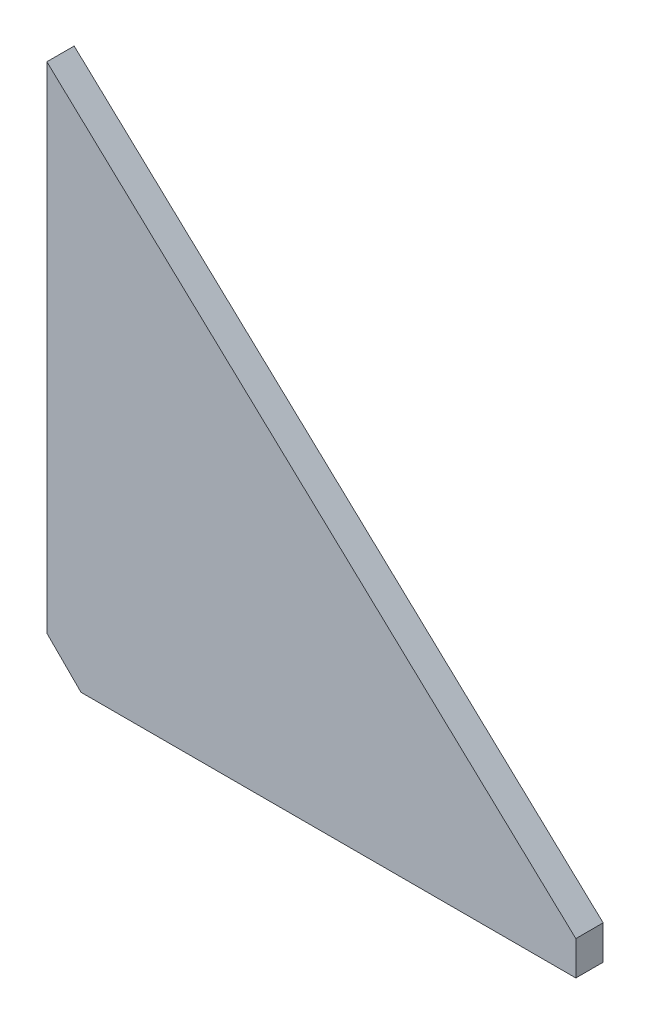
ISO-10303-21;
HEADER;
FILE_DESCRIPTION(('STEP AP214'),'2;1');
FILE_NAME('part.step','',(''),(''),'','','');
FILE_SCHEMA(('AUTOMOTIVE_DESIGN { 1 0 10303 214 1 1 1 1 }'));
ENDSEC;
DATA;
#1=APPLICATION_CONTEXT('core data for automotive mechanical design processes');
#2=APPLICATION_PROTOCOL_DEFINITION('international standard','automotive_design',2000,#1);
#3=PRODUCT_CONTEXT('',#1,'mechanical');
#4=PRODUCT('Part','Part','',(#3));
#5=PRODUCT_RELATED_PRODUCT_CATEGORY('part','',(#4));
#6=PRODUCT_DEFINITION_FORMATION('','',#4);
#7=PRODUCT_DEFINITION_CONTEXT('part definition',#1,'design');
#8=PRODUCT_DEFINITION('design','',#6,#7);
#9=PRODUCT_DEFINITION_SHAPE('','',#8);
#10=(LENGTH_UNIT() NAMED_UNIT(*) SI_UNIT(.MILLI.,.METRE.));
#11=(NAMED_UNIT(*) PLANE_ANGLE_UNIT() SI_UNIT($,.RADIAN.));
#12=(NAMED_UNIT(*) SI_UNIT($,.STERADIAN.) SOLID_ANGLE_UNIT());
#13=UNCERTAINTY_MEASURE_WITH_UNIT(LENGTH_MEASURE(1.E-05),#10,'distance_accuracy_value','');
#14=(GEOMETRIC_REPRESENTATION_CONTEXT(3) GLOBAL_UNCERTAINTY_ASSIGNED_CONTEXT((#13)) GLOBAL_UNIT_ASSIGNED_CONTEXT((#10,
#11,#12)) REPRESENTATION_CONTEXT('',''));
#15=CARTESIAN_POINT('',(0.,0.,0.));
#16=DIRECTION('',(0.,0.,1.));
#17=DIRECTION('',(1.,0.,0.));
#18=AXIS2_PLACEMENT_3D('',#15,#16,#17);
#19=CARTESIAN_POINT('',(66.9213649851632,-2.98961424332345,8.));
#20=DIRECTION('',(-1.,0.,0.));
#21=DIRECTION('',(0.,0.,1.));
#22=AXIS2_PLACEMENT_3D('',#19,#20,#21);
#23=PLANE('',#22);
#24=DIRECTION('',(0.,1.,0.));
#25=VECTOR('',#24,1.);
#26=CARTESIAN_POINT('',(66.9213649851632,-2.98961424332345,0.));
#27=LINE('',#26,#25);
#28=CARTESIAN_POINT('',(66.9213649851632,-2.98961424332345,0.));
#29=VERTEX_POINT('',#28);
#30=CARTESIAN_POINT('',(66.9213649851632,7.01038575667657,0.));
#31=VERTEX_POINT('',#30);
#32=EDGE_CURVE('E110',#29,#31,#27,.T.);
#33=ORIENTED_EDGE('',*,*,#32,.T.);
#34=DIRECTION('',(0.,0.,-1.));
#35=VECTOR('',#34,1.);
#36=CARTESIAN_POINT('',(66.9213649851632,7.01038575667657,8.));
#37=LINE('',#36,#35);
#38=CARTESIAN_POINT('',(66.9213649851632,7.01038575667657,8.));
#39=VERTEX_POINT('',#38);
#40=EDGE_CURVE('E11',#39,#31,#37,.T.);
#41=ORIENTED_EDGE('',*,*,#40,.F.);
#42=DIRECTION('',(0.,1.,0.));
#43=VECTOR('',#42,1.);
#44=CARTESIAN_POINT('',(66.9213649851632,-2.98961424332345,8.));
#45=LINE('',#44,#43);
#46=CARTESIAN_POINT('',(66.9213649851632,-2.98961424332345,8.));
#47=VERTEX_POINT('',#46);
#48=EDGE_CURVE('E118',#47,#39,#45,.T.);
#49=ORIENTED_EDGE('',*,*,#48,.F.);
#50=DIRECTION('',(0.,0.,-1.));
#51=VECTOR('',#50,1.);
#52=CARTESIAN_POINT('',(66.9213649851632,-2.98961424332345,8.));
#53=LINE('',#52,#51);
#54=EDGE_CURVE('E106',#47,#29,#53,.T.);
#55=ORIENTED_EDGE('',*,*,#54,.T.);
#56=EDGE_LOOP('',(#33,#41,#49,#55));
#57=FACE_BOUND('',#56,.T.);
#58=ADVANCED_FACE('F36',(#57),#23,.F.);
#59=CARTESIAN_POINT('',(66.9213649851632,7.01038575667657,8.));
#60=DIRECTION('',(-0.683157128775741,-0.730271413518896,0.));
#61=DIRECTION('',(0.730271413518896,-0.683157128775741,0.));
#62=AXIS2_PLACEMENT_3D('',#59,#60,#61);
#63=PLANE('',#62);
#64=DIRECTION('',(-0.730271413518896,0.683157128775741,0.));
#65=VECTOR('',#64,1.);
#66=CARTESIAN_POINT('',(66.9213649851632,7.01038575667657,0.));
#67=LINE('',#66,#65);
#68=CARTESIAN_POINT('',(-88.0786350148368,152.010385756677,0.));
#69=VERTEX_POINT('',#68);
#70=EDGE_CURVE('E113',#31,#69,#67,.T.);
#71=ORIENTED_EDGE('',*,*,#70,.T.);
#72=DIRECTION('',(0.,0.,-1.));
#73=VECTOR('',#72,1.);
#74=CARTESIAN_POINT('',(-88.0786350148368,152.010385756677,8.));
#75=LINE('',#74,#73);
#76=CARTESIAN_POINT('',(-88.0786350148368,152.010385756677,8.));
#77=VERTEX_POINT('',#76);
#78=EDGE_CURVE('E44',#77,#69,#75,.T.);
#79=ORIENTED_EDGE('',*,*,#78,.F.);
#80=DIRECTION('',(-0.730271413518896,0.683157128775741,0.));
#81=VECTOR('',#80,1.);
#82=CARTESIAN_POINT('',(66.9213649851632,7.01038575667657,8.));
#83=LINE('',#82,#81);
#84=EDGE_CURVE('E86',#39,#77,#83,.T.);
#85=ORIENTED_EDGE('',*,*,#84,.F.);
#86=ORIENTED_EDGE('',*,*,#40,.T.);
#87=EDGE_LOOP('',(#71,#79,#85,#86));
#88=FACE_BOUND('',#87,.T.);
#89=ADVANCED_FACE('F137',(#88),#63,.F.);
#90=CARTESIAN_POINT('',(-88.0786350148368,7.01038575667655,8.));
#91=DIRECTION('',(1.,0.,0.));
#92=DIRECTION('',(0.,0.,-1.));
#93=AXIS2_PLACEMENT_3D('',#90,#91,#92);
#94=PLANE('',#93);
#95=DIRECTION('',(0.,-1.,0.));
#96=VECTOR('',#95,1.);
#97=CARTESIAN_POINT('',(-88.0786350148368,7.01038575667655,0.));
#98=LINE('',#97,#96);
#99=CARTESIAN_POINT('',(-88.0786350148368,7.01038575667655,0.));
#100=VERTEX_POINT('',#99);
#101=EDGE_CURVE('E101',#69,#100,#98,.T.);
#102=ORIENTED_EDGE('',*,*,#101,.T.);
#103=DIRECTION('',(0.,0.,-1.));
#104=VECTOR('',#103,1.);
#105=CARTESIAN_POINT('',(-88.0786350148368,7.01038575667655,8.));
#106=LINE('',#105,#104);
#107=CARTESIAN_POINT('',(-88.0786350148368,7.01038575667655,8.));
#108=VERTEX_POINT('',#107);
#109=EDGE_CURVE('E98',#108,#100,#106,.T.);
#110=ORIENTED_EDGE('',*,*,#109,.F.);
#111=DIRECTION('',(0.,-1.,0.));
#112=VECTOR('',#111,1.);
#113=CARTESIAN_POINT('',(-88.0786350148368,7.01038575667655,8.));
#114=LINE('',#113,#112);
#115=EDGE_CURVE('E90',#77,#108,#114,.T.);
#116=ORIENTED_EDGE('',*,*,#115,.F.);
#117=ORIENTED_EDGE('',*,*,#78,.T.);
#118=EDGE_LOOP('',(#102,#110,#116,#117));
#119=FACE_BOUND('',#118,.T.);
#120=ADVANCED_FACE('F99',(#119),#94,.F.);
#121=CARTESIAN_POINT('',(-88.0786350148368,7.01038575667655,8.));
#122=DIRECTION('',(0.707106781186548,0.707106781186547,0.));
#123=DIRECTION('',(-0.707106781186547,0.707106781186548,0.));
#124=AXIS2_PLACEMENT_3D('',#121,#122,#123);
#125=PLANE('',#124);
#126=DIRECTION('',(0.707106781186547,-0.707106781186548,0.));
#127=VECTOR('',#126,1.);
#128=CARTESIAN_POINT('',(-88.0786350148368,7.01038575667655,0.));
#129=LINE('',#128,#127);
#130=CARTESIAN_POINT('',(-78.0786350148368,-2.98961424332345,0.));
#131=VERTEX_POINT('',#130);
#132=EDGE_CURVE('E72',#100,#131,#129,.T.);
#133=ORIENTED_EDGE('',*,*,#132,.T.);
#134=DIRECTION('',(0.,0.,-1.));
#135=VECTOR('',#134,1.);
#136=CARTESIAN_POINT('',(-78.0786350148368,-2.98961424332345,8.));
#137=LINE('',#136,#135);
#138=CARTESIAN_POINT('',(-78.0786350148368,-2.98961424332345,8.));
#139=VERTEX_POINT('',#138);
#140=EDGE_CURVE('E102',#139,#131,#137,.T.);
#141=ORIENTED_EDGE('',*,*,#140,.F.);
#142=DIRECTION('',(0.707106781186547,-0.707106781186548,0.));
#143=VECTOR('',#142,1.);
#144=CARTESIAN_POINT('',(-88.0786350148368,7.01038575667655,8.));
#145=LINE('',#144,#143);
#146=EDGE_CURVE('E94',#108,#139,#145,.T.);
#147=ORIENTED_EDGE('',*,*,#146,.F.);
#148=ORIENTED_EDGE('',*,*,#109,.T.);
#149=EDGE_LOOP('',(#133,#141,#147,#148));
#150=FACE_BOUND('',#149,.T.);
#151=ADVANCED_FACE('F104',(#150),#125,.F.);
#152=CARTESIAN_POINT('',(66.9213649851632,-2.98961424332345,8.));
#153=DIRECTION('',(0.,1.,0.));
#154=DIRECTION('',(-1.,0.,0.));
#155=AXIS2_PLACEMENT_3D('',#152,#153,#154);
#156=PLANE('',#155);
#157=DIRECTION('',(1.,0.,0.));
#158=VECTOR('',#157,1.);
#159=CARTESIAN_POINT('',(66.9213649851632,-2.98961424332345,0.));
#160=LINE('',#159,#158);
#161=EDGE_CURVE('E78',#131,#29,#160,.T.);
#162=ORIENTED_EDGE('',*,*,#161,.T.);
#163=ORIENTED_EDGE('',*,*,#54,.F.);
#164=DIRECTION('',(1.,0.,0.));
#165=VECTOR('',#164,1.);
#166=CARTESIAN_POINT('',(66.9213649851632,-2.98961424332345,8.));
#167=LINE('',#166,#165);
#168=EDGE_CURVE('E52',#139,#47,#167,.T.);
#169=ORIENTED_EDGE('',*,*,#168,.F.);
#170=ORIENTED_EDGE('',*,*,#140,.T.);
#171=EDGE_LOOP('',(#162,#163,#169,#170));
#172=FACE_BOUND('',#171,.T.);
#173=ADVANCED_FACE('F126',(#172),#156,.F.);
#174=CARTESIAN_POINT('',(0.,0.,8.));
#175=DIRECTION('',(0.,0.,1.));
#176=DIRECTION('',(1.,0.,0.));
#177=AXIS2_PLACEMENT_3D('',#174,#175,#176);
#178=PLANE('',#177);
#179=ORIENTED_EDGE('',*,*,#48,.T.);
#180=ORIENTED_EDGE('',*,*,#84,.T.);
#181=ORIENTED_EDGE('',*,*,#115,.T.);
#182=ORIENTED_EDGE('',*,*,#146,.T.);
#183=ORIENTED_EDGE('',*,*,#168,.T.);
#184=EDGE_LOOP('',(#179,#180,#181,#182,#183));
#185=FACE_BOUND('',#184,.T.);
#186=ADVANCED_FACE('F92',(#185),#178,.T.);
#187=CARTESIAN_POINT('',(0.,0.,0.));
#188=DIRECTION('',(0.,0.,1.));
#189=DIRECTION('',(1.,0.,0.));
#190=AXIS2_PLACEMENT_3D('',#187,#188,#189);
#191=PLANE('',#190);
#192=ORIENTED_EDGE('',*,*,#32,.F.);
#193=ORIENTED_EDGE('',*,*,#161,.F.);
#194=ORIENTED_EDGE('',*,*,#132,.F.);
#195=ORIENTED_EDGE('',*,*,#101,.F.);
#196=ORIENTED_EDGE('',*,*,#70,.F.);
#197=EDGE_LOOP('',(#192,#193,#194,#195,#196));
#198=FACE_BOUND('',#197,.T.);
#199=ADVANCED_FACE('F122',(#198),#191,.F.);
#200=CLOSED_SHELL('',(#58,#89,#120,#151,#173,#186,#199));
#201=MANIFOLD_SOLID_BREP('B2',#200);
#202=ADVANCED_BREP_SHAPE_REPRESENTATION('',(#18,#201),#14);
#203=SHAPE_DEFINITION_REPRESENTATION(#9,#202);
ENDSEC;
END-ISO-10303-21;
